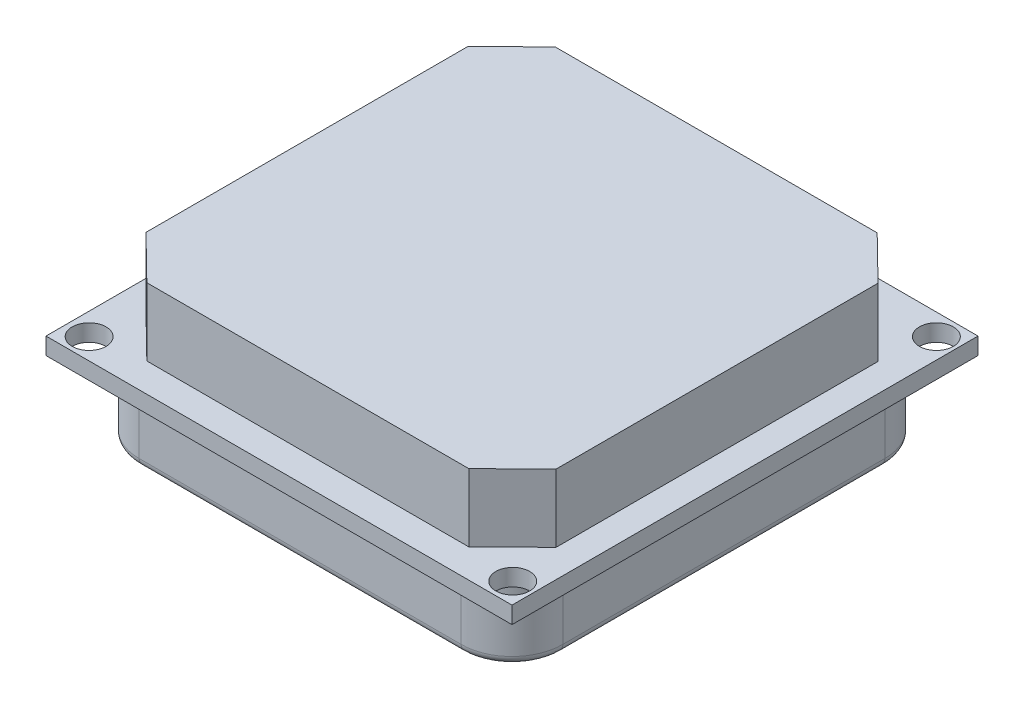
ISO-10303-21;
HEADER;
FILE_DESCRIPTION(('STEP AP214'),'2;1');
FILE_NAME('part.step','',(''),(''),'','','');
FILE_SCHEMA(('AUTOMOTIVE_DESIGN { 1 0 10303 214 1 1 1 1 }'));
ENDSEC;
DATA;
#1=APPLICATION_CONTEXT('core data for automotive mechanical design processes');
#2=APPLICATION_PROTOCOL_DEFINITION('international standard','automotive_design',2000,#1);
#3=PRODUCT_CONTEXT('',#1,'mechanical');
#4=PRODUCT('Part','Part','',(#3));
#5=PRODUCT_RELATED_PRODUCT_CATEGORY('part','',(#4));
#6=PRODUCT_DEFINITION_FORMATION('','',#4);
#7=PRODUCT_DEFINITION_CONTEXT('part definition',#1,'design');
#8=PRODUCT_DEFINITION('design','',#6,#7);
#9=PRODUCT_DEFINITION_SHAPE('','',#8);
#10=(LENGTH_UNIT() NAMED_UNIT(*) SI_UNIT(.MILLI.,.METRE.));
#11=(NAMED_UNIT(*) PLANE_ANGLE_UNIT() SI_UNIT($,.RADIAN.));
#12=(NAMED_UNIT(*) SI_UNIT($,.STERADIAN.) SOLID_ANGLE_UNIT());
#13=UNCERTAINTY_MEASURE_WITH_UNIT(LENGTH_MEASURE(1.E-05),#10,'distance_accuracy_value','');
#14=(GEOMETRIC_REPRESENTATION_CONTEXT(3) GLOBAL_UNCERTAINTY_ASSIGNED_CONTEXT((#13)) GLOBAL_UNIT_ASSIGNED_CONTEXT((#10,
#11,#12)) REPRESENTATION_CONTEXT('',''));
#15=CARTESIAN_POINT('',(0.,0.,0.));
#16=DIRECTION('',(0.,0.,1.));
#17=DIRECTION('',(1.,0.,0.));
#18=AXIS2_PLACEMENT_3D('',#15,#16,#17);
#19=CARTESIAN_POINT('',(0.,0.,0.));
#20=DIRECTION('',(0.,1.,0.));
#21=DIRECTION('',(0.,0.,1.));
#22=AXIS2_PLACEMENT_3D('',#19,#20,#21);
#23=PLANE('',#22);
#24=DIRECTION('',(-1.,0.,0.));
#25=VECTOR('',#24,1.);
#26=CARTESIAN_POINT('',(13.75,0.,-13.75));
#27=LINE('',#26,#25);
#28=CARTESIAN_POINT('',(13.75,0.,-13.75));
#29=VERTEX_POINT('',#28);
#30=CARTESIAN_POINT('',(-13.75,0.,-13.75));
#31=VERTEX_POINT('',#30);
#32=EDGE_CURVE('E324',#29,#31,#27,.T.);
#33=ORIENTED_EDGE('',*,*,#32,.F.);
#34=DIRECTION('',(0.,0.,-1.));
#35=VECTOR('',#34,1.);
#36=CARTESIAN_POINT('',(13.75,0.,-13.75));
#37=LINE('',#36,#35);
#38=CARTESIAN_POINT('',(13.75,0.,13.75));
#39=VERTEX_POINT('',#38);
#40=EDGE_CURVE('E331',#39,#29,#37,.T.);
#41=ORIENTED_EDGE('',*,*,#40,.F.);
#42=DIRECTION('',(1.,0.,0.));
#43=VECTOR('',#42,1.);
#44=CARTESIAN_POINT('',(13.75,0.,13.75));
#45=LINE('',#44,#43);
#46=CARTESIAN_POINT('',(-13.75,0.,13.75));
#47=VERTEX_POINT('',#46);
#48=EDGE_CURVE('E342',#47,#39,#45,.T.);
#49=ORIENTED_EDGE('',*,*,#48,.F.);
#50=DIRECTION('',(0.,0.,1.));
#51=VECTOR('',#50,1.);
#52=CARTESIAN_POINT('',(-13.75,0.,-13.75));
#53=LINE('',#52,#51);
#54=EDGE_CURVE('E340',#31,#47,#53,.T.);
#55=ORIENTED_EDGE('',*,*,#54,.F.);
#56=EDGE_LOOP('',(#33,#41,#49,#55));
#57=FACE_BOUND('',#56,.T.);
#58=CARTESIAN_POINT('',(-12.4479717343854,0.,-12.4920969026307));
#59=DIRECTION('',(0.,1.,0.));
#60=DIRECTION('',(0.,0.,1.));
#61=AXIS2_PLACEMENT_3D('',#58,#59,#60);
#62=CIRCLE('',#61,1.);
#63=CARTESIAN_POINT('',(-12.4479717343854,0.,-11.4920969026307));
#64=VERTEX_POINT('',#63);
#65=EDGE_CURVE('E321',#64,#64,#62,.T.);
#66=ORIENTED_EDGE('',*,*,#65,.T.);
#67=EDGE_LOOP('',(#66));
#68=FACE_BOUND('',#67,.T.);
#69=CARTESIAN_POINT('',(12.5520282656146,0.,-12.4920969026307));
#70=DIRECTION('',(0.,1.,0.));
#71=DIRECTION('',(0.,0.,1.));
#72=AXIS2_PLACEMENT_3D('',#69,#70,#71);
#73=CIRCLE('',#72,1.);
#74=CARTESIAN_POINT('',(12.5520282656146,0.,-11.4920969026307));
#75=VERTEX_POINT('',#74);
#76=EDGE_CURVE('E303',#75,#75,#73,.T.);
#77=ORIENTED_EDGE('',*,*,#76,.T.);
#78=EDGE_LOOP('',(#77));
#79=FACE_BOUND('',#78,.T.);
#80=CARTESIAN_POINT('',(12.5520282656146,0.,12.5079030973693));
#81=DIRECTION('',(0.,1.,0.));
#82=DIRECTION('',(0.,0.,1.));
#83=AXIS2_PLACEMENT_3D('',#80,#81,#82);
#84=CIRCLE('',#83,1.);
#85=CARTESIAN_POINT('',(12.5520282656146,0.,13.5079030973693));
#86=VERTEX_POINT('',#85);
#87=EDGE_CURVE('E310',#86,#86,#84,.T.);
#88=ORIENTED_EDGE('',*,*,#87,.T.);
#89=EDGE_LOOP('',(#88));
#90=FACE_BOUND('',#89,.T.);
#91=CARTESIAN_POINT('',(-12.4479717343854,0.,12.5079030973693));
#92=DIRECTION('',(0.,1.,0.));
#93=DIRECTION('',(0.,0.,1.));
#94=AXIS2_PLACEMENT_3D('',#91,#92,#93);
#95=CIRCLE('',#94,1.);
#96=CARTESIAN_POINT('',(-12.4479717343854,0.,13.5079030973693));
#97=VERTEX_POINT('',#96);
#98=EDGE_CURVE('E316',#97,#97,#95,.T.);
#99=ORIENTED_EDGE('',*,*,#98,.T.);
#100=EDGE_LOOP('',(#99));
#101=FACE_BOUND('',#100,.T.);
#102=CARTESIAN_POINT('',(-9.5,0.,9.5));
#103=DIRECTION('',(0.,-1.,0.));
#104=DIRECTION('',(0.,0.,1.));
#105=AXIS2_PLACEMENT_3D('',#102,#103,#104);
#106=CIRCLE('',#105,3.);
#107=CARTESIAN_POINT('',(-9.5,0.,12.5));
#108=VERTEX_POINT('',#107);
#109=CARTESIAN_POINT('',(-12.5,0.,9.5));
#110=VERTEX_POINT('',#109);
#111=EDGE_CURVE('E206',#108,#110,#106,.T.);
#112=ORIENTED_EDGE('',*,*,#111,.F.);
#113=DIRECTION('',(-1.,0.,0.));
#114=VECTOR('',#113,1.);
#115=CARTESIAN_POINT('',(-9.5,0.,12.5));
#116=LINE('',#115,#114);
#117=CARTESIAN_POINT('',(9.5,0.,12.5));
#118=VERTEX_POINT('',#117);
#119=EDGE_CURVE('E212',#118,#108,#116,.T.);
#120=ORIENTED_EDGE('',*,*,#119,.F.);
#121=CARTESIAN_POINT('',(9.5,0.,9.5));
#122=DIRECTION('',(0.,-1.,0.));
#123=DIRECTION('',(0.,0.,1.));
#124=AXIS2_PLACEMENT_3D('',#121,#122,#123);
#125=CIRCLE('',#124,3.00000000000001);
#126=CARTESIAN_POINT('',(12.5,0.,9.5));
#127=VERTEX_POINT('',#126);
#128=EDGE_CURVE('E226',#127,#118,#125,.T.);
#129=ORIENTED_EDGE('',*,*,#128,.F.);
#130=DIRECTION('',(0.,0.,1.));
#131=VECTOR('',#130,1.);
#132=CARTESIAN_POINT('',(12.5,0.,9.5));
#133=LINE('',#132,#131);
#134=CARTESIAN_POINT('',(12.5,0.,-9.5));
#135=VERTEX_POINT('',#134);
#136=EDGE_CURVE('E228',#135,#127,#133,.T.);
#137=ORIENTED_EDGE('',*,*,#136,.F.);
#138=CARTESIAN_POINT('',(9.49999999999999,0.,-9.5));
#139=DIRECTION('',(0.,-1.,0.));
#140=DIRECTION('',(0.,0.,1.));
#141=AXIS2_PLACEMENT_3D('',#138,#139,#140);
#142=CIRCLE('',#141,3.00000000000001);
#143=CARTESIAN_POINT('',(9.5,0.,-12.5));
#144=VERTEX_POINT('',#143);
#145=EDGE_CURVE('E425',#144,#135,#142,.T.);
#146=ORIENTED_EDGE('',*,*,#145,.F.);
#147=DIRECTION('',(1.,0.,0.));
#148=VECTOR('',#147,1.);
#149=CARTESIAN_POINT('',(9.5,0.,-12.5));
#150=LINE('',#149,#148);
#151=CARTESIAN_POINT('',(-9.5,0.,-12.5));
#152=VERTEX_POINT('',#151);
#153=EDGE_CURVE('E422',#152,#144,#150,.T.);
#154=ORIENTED_EDGE('',*,*,#153,.F.);
#155=CARTESIAN_POINT('',(-9.5,0.,-9.50000000000001));
#156=DIRECTION('',(0.,-1.,0.));
#157=DIRECTION('',(0.,0.,1.));
#158=AXIS2_PLACEMENT_3D('',#155,#156,#157);
#159=CIRCLE('',#158,2.99999999999999);
#160=CARTESIAN_POINT('',(-12.5,0.,-9.5));
#161=VERTEX_POINT('',#160);
#162=EDGE_CURVE('E419',#161,#152,#159,.T.);
#163=ORIENTED_EDGE('',*,*,#162,.F.);
#164=DIRECTION('',(0.,0.,-1.));
#165=VECTOR('',#164,1.);
#166=CARTESIAN_POINT('',(-12.5,0.,-9.5));
#167=LINE('',#166,#165);
#168=EDGE_CURVE('E221',#110,#161,#167,.T.);
#169=ORIENTED_EDGE('',*,*,#168,.F.);
#170=EDGE_LOOP('',(#112,#120,#129,#137,#146,#154,#163,#169));
#171=FACE_BOUND('',#170,.T.);
#172=ADVANCED_FACE('F40',(#57,#68,#79,#90,#101,#171),#23,.F.);
#173=CARTESIAN_POINT('',(0.,1.,0.));
#174=DIRECTION('',(0.,1.,0.));
#175=DIRECTION('',(0.,0.,1.));
#176=AXIS2_PLACEMENT_3D('',#173,#174,#175);
#177=PLANE('',#176);
#178=CARTESIAN_POINT('',(-12.4479717343854,1.,12.5079030973693));
#179=DIRECTION('',(0.,1.,0.));
#180=DIRECTION('',(0.,0.,1.));
#181=AXIS2_PLACEMENT_3D('',#178,#179,#180);
#182=CIRCLE('',#181,1.);
#183=CARTESIAN_POINT('',(-12.4479717343854,1.,13.5079030973693));
#184=VERTEX_POINT('',#183);
#185=EDGE_CURVE('E302',#184,#184,#182,.T.);
#186=ORIENTED_EDGE('',*,*,#185,.F.);
#187=EDGE_LOOP('',(#186));
#188=FACE_BOUND('',#187,.T.);
#189=CARTESIAN_POINT('',(12.5520282656146,1.,12.5079030973693));
#190=DIRECTION('',(0.,1.,0.));
#191=DIRECTION('',(0.,0.,1.));
#192=AXIS2_PLACEMENT_3D('',#189,#190,#191);
#193=CIRCLE('',#192,1.);
#194=CARTESIAN_POINT('',(12.5520282656146,1.,13.5079030973693));
#195=VERTEX_POINT('',#194);
#196=EDGE_CURVE('E313',#195,#195,#193,.T.);
#197=ORIENTED_EDGE('',*,*,#196,.F.);
#198=EDGE_LOOP('',(#197));
#199=FACE_BOUND('',#198,.T.);
#200=CARTESIAN_POINT('',(12.5520282656146,1.,-12.4920969026307));
#201=DIRECTION('',(0.,1.,0.));
#202=DIRECTION('',(0.,0.,1.));
#203=AXIS2_PLACEMENT_3D('',#200,#201,#202);
#204=CIRCLE('',#203,1.);
#205=CARTESIAN_POINT('',(12.5520282656146,1.,-11.4920969026307));
#206=VERTEX_POINT('',#205);
#207=EDGE_CURVE('E307',#206,#206,#204,.T.);
#208=ORIENTED_EDGE('',*,*,#207,.F.);
#209=EDGE_LOOP('',(#208));
#210=FACE_BOUND('',#209,.T.);
#211=CARTESIAN_POINT('',(-12.4479717343854,1.,-12.4920969026307));
#212=DIRECTION('',(0.,1.,0.));
#213=DIRECTION('',(0.,0.,1.));
#214=AXIS2_PLACEMENT_3D('',#211,#212,#213);
#215=CIRCLE('',#214,1.);
#216=CARTESIAN_POINT('',(-12.4479717343854,1.,-11.4920969026307));
#217=VERTEX_POINT('',#216);
#218=EDGE_CURVE('E306',#217,#217,#215,.T.);
#219=ORIENTED_EDGE('',*,*,#218,.F.);
#220=EDGE_LOOP('',(#219));
#221=FACE_BOUND('',#220,.T.);
#222=DIRECTION('',(-1.,0.,0.));
#223=VECTOR('',#222,1.);
#224=CARTESIAN_POINT('',(13.75,1.,-13.75));
#225=LINE('',#224,#223);
#226=CARTESIAN_POINT('',(13.75,1.,-13.75));
#227=VERTEX_POINT('',#226);
#228=CARTESIAN_POINT('',(-13.75,1.,-13.75));
#229=VERTEX_POINT('',#228);
#230=EDGE_CURVE('E327',#227,#229,#225,.T.);
#231=ORIENTED_EDGE('',*,*,#230,.T.);
#232=DIRECTION('',(0.,0.,1.));
#233=VECTOR('',#232,1.);
#234=CARTESIAN_POINT('',(-13.75,1.,-13.75));
#235=LINE('',#234,#233);
#236=CARTESIAN_POINT('',(-13.75,1.,13.75));
#237=VERTEX_POINT('',#236);
#238=EDGE_CURVE('E330',#229,#237,#235,.T.);
#239=ORIENTED_EDGE('',*,*,#238,.T.);
#240=DIRECTION('',(1.,0.,0.));
#241=VECTOR('',#240,1.);
#242=CARTESIAN_POINT('',(13.75,1.,13.75));
#243=LINE('',#242,#241);
#244=CARTESIAN_POINT('',(13.75,1.,13.75));
#245=VERTEX_POINT('',#244);
#246=EDGE_CURVE('E333',#237,#245,#243,.T.);
#247=ORIENTED_EDGE('',*,*,#246,.T.);
#248=DIRECTION('',(0.,0.,-1.));
#249=VECTOR('',#248,1.);
#250=CARTESIAN_POINT('',(13.75,1.,-13.75));
#251=LINE('',#250,#249);
#252=EDGE_CURVE('E335',#245,#227,#251,.T.);
#253=ORIENTED_EDGE('',*,*,#252,.T.);
#254=EDGE_LOOP('',(#231,#239,#247,#253));
#255=FACE_BOUND('',#254,.T.);
#256=DIRECTION('',(0.713938248596245,0.,0.700208666892468));
#257=VECTOR('',#256,1.);
#258=CARTESIAN_POINT('',(-12.1,1.,9.5));
#259=LINE('',#258,#257);
#260=CARTESIAN_POINT('',(-12.1,1.,9.5));
#261=VERTEX_POINT('',#260);
#262=CARTESIAN_POINT('',(-9.49999999999999,1.,12.05));
#263=VERTEX_POINT('',#262);
#264=EDGE_CURVE('E267',#261,#263,#259,.T.);
#265=ORIENTED_EDGE('',*,*,#264,.F.);
#266=DIRECTION('',(0.,0.,1.));
#267=VECTOR('',#266,1.);
#268=CARTESIAN_POINT('',(-12.1,1.,-9.5));
#269=LINE('',#268,#267);
#270=CARTESIAN_POINT('',(-12.1,1.,-9.5));
#271=VERTEX_POINT('',#270);
#272=EDGE_CURVE('E245',#271,#261,#269,.T.);
#273=ORIENTED_EDGE('',*,*,#272,.F.);
#274=DIRECTION('',(-0.713938248596244,0.,0.700208666892468));
#275=VECTOR('',#274,1.);
#276=CARTESIAN_POINT('',(-9.49999999999999,1.,-12.05));
#277=LINE('',#276,#275);
#278=CARTESIAN_POINT('',(-9.49999999999999,1.,-12.05));
#279=VERTEX_POINT('',#278);
#280=EDGE_CURVE('E250',#279,#271,#277,.T.);
#281=ORIENTED_EDGE('',*,*,#280,.F.);
#282=DIRECTION('',(-1.,0.,0.));
#283=VECTOR('',#282,1.);
#284=CARTESIAN_POINT('',(9.5,1.,-12.05));
#285=LINE('',#284,#283);
#286=CARTESIAN_POINT('',(9.5,1.,-12.05));
#287=VERTEX_POINT('',#286);
#288=EDGE_CURVE('E277',#287,#279,#285,.T.);
#289=ORIENTED_EDGE('',*,*,#288,.F.);
#290=DIRECTION('',(-0.713938248596244,0.,-0.700208666892468));
#291=VECTOR('',#290,1.);
#292=CARTESIAN_POINT('',(12.1,1.,-9.50000000000001));
#293=LINE('',#292,#291);
#294=CARTESIAN_POINT('',(12.1,1.,-9.50000000000001));
#295=VERTEX_POINT('',#294);
#296=EDGE_CURVE('E275',#295,#287,#293,.T.);
#297=ORIENTED_EDGE('',*,*,#296,.F.);
#298=DIRECTION('',(0.,0.,-1.));
#299=VECTOR('',#298,1.);
#300=CARTESIAN_POINT('',(12.1,1.,9.49999999999999));
#301=LINE('',#300,#299);
#302=CARTESIAN_POINT('',(12.1,1.,9.49999999999999));
#303=VERTEX_POINT('',#302);
#304=EDGE_CURVE('E273',#303,#295,#301,.T.);
#305=ORIENTED_EDGE('',*,*,#304,.F.);
#306=DIRECTION('',(0.713938248596243,0.,-0.700208666892469));
#307=VECTOR('',#306,1.);
#308=CARTESIAN_POINT('',(9.5,1.,12.05));
#309=LINE('',#308,#307);
#310=CARTESIAN_POINT('',(9.5,1.,12.05));
#311=VERTEX_POINT('',#310);
#312=EDGE_CURVE('E271',#311,#303,#309,.T.);
#313=ORIENTED_EDGE('',*,*,#312,.F.);
#314=DIRECTION('',(1.,0.,0.));
#315=VECTOR('',#314,1.);
#316=CARTESIAN_POINT('',(-9.49999999999999,1.,12.05));
#317=LINE('',#316,#315);
#318=EDGE_CURVE('E269',#263,#311,#317,.T.);
#319=ORIENTED_EDGE('',*,*,#318,.F.);
#320=EDGE_LOOP('',(#265,#273,#281,#289,#297,#305,#313,#319));
#321=FACE_BOUND('',#320,.T.);
#322=ADVANCED_FACE('F488',(#188,#199,#210,#221,#255,#321),#177,.T.);
#323=CARTESIAN_POINT('',(13.75,1.,-13.75));
#324=DIRECTION('',(0.,0.,1.));
#325=DIRECTION('',(1.,0.,0.));
#326=AXIS2_PLACEMENT_3D('',#323,#324,#325);
#327=PLANE('',#326);
#328=ORIENTED_EDGE('',*,*,#32,.T.);
#329=DIRECTION('',(0.,-1.,0.));
#330=VECTOR('',#329,1.);
#331=CARTESIAN_POINT('',(-13.75,1.,-13.75));
#332=LINE('',#331,#330);
#333=EDGE_CURVE('E353',#229,#31,#332,.T.);
#334=ORIENTED_EDGE('',*,*,#333,.F.);
#335=ORIENTED_EDGE('',*,*,#230,.F.);
#336=DIRECTION('',(0.,-1.,0.));
#337=VECTOR('',#336,1.);
#338=CARTESIAN_POINT('',(13.75,1.,-13.75));
#339=LINE('',#338,#337);
#340=EDGE_CURVE('E337',#227,#29,#339,.T.);
#341=ORIENTED_EDGE('',*,*,#340,.T.);
#342=EDGE_LOOP('',(#328,#334,#335,#341));
#343=FACE_BOUND('',#342,.T.);
#344=ADVANCED_FACE('F494',(#343),#327,.F.);
#345=CARTESIAN_POINT('',(-13.75,1.,-13.75));
#346=DIRECTION('',(1.,0.,0.));
#347=DIRECTION('',(0.,0.,-1.));
#348=AXIS2_PLACEMENT_3D('',#345,#346,#347);
#349=PLANE('',#348);
#350=ORIENTED_EDGE('',*,*,#54,.T.);
#351=DIRECTION('',(0.,-1.,0.));
#352=VECTOR('',#351,1.);
#353=CARTESIAN_POINT('',(-13.75,1.,13.75));
#354=LINE('',#353,#352);
#355=EDGE_CURVE('E350',#237,#47,#354,.T.);
#356=ORIENTED_EDGE('',*,*,#355,.F.);
#357=ORIENTED_EDGE('',*,*,#238,.F.);
#358=ORIENTED_EDGE('',*,*,#333,.T.);
#359=EDGE_LOOP('',(#350,#356,#357,#358));
#360=FACE_BOUND('',#359,.T.);
#361=ADVANCED_FACE('F509',(#360),#349,.F.);
#362=CARTESIAN_POINT('',(13.75,1.,13.75));
#363=DIRECTION('',(0.,0.,-1.));
#364=DIRECTION('',(-1.,0.,0.));
#365=AXIS2_PLACEMENT_3D('',#362,#363,#364);
#366=PLANE('',#365);
#367=ORIENTED_EDGE('',*,*,#48,.T.);
#368=DIRECTION('',(0.,-1.,0.));
#369=VECTOR('',#368,1.);
#370=CARTESIAN_POINT('',(13.75,1.,13.75));
#371=LINE('',#370,#369);
#372=EDGE_CURVE('E347',#245,#39,#371,.T.);
#373=ORIENTED_EDGE('',*,*,#372,.F.);
#374=ORIENTED_EDGE('',*,*,#246,.F.);
#375=ORIENTED_EDGE('',*,*,#355,.T.);
#376=EDGE_LOOP('',(#367,#373,#374,#375));
#377=FACE_BOUND('',#376,.T.);
#378=ADVANCED_FACE('F505',(#377),#366,.F.);
#379=CARTESIAN_POINT('',(13.75,1.,-13.75));
#380=DIRECTION('',(-1.,0.,0.));
#381=DIRECTION('',(0.,0.,1.));
#382=AXIS2_PLACEMENT_3D('',#379,#380,#381);
#383=PLANE('',#382);
#384=ORIENTED_EDGE('',*,*,#40,.T.);
#385=ORIENTED_EDGE('',*,*,#340,.F.);
#386=ORIENTED_EDGE('',*,*,#252,.F.);
#387=ORIENTED_EDGE('',*,*,#372,.T.);
#388=EDGE_LOOP('',(#384,#385,#386,#387));
#389=FACE_BOUND('',#388,.T.);
#390=ADVANCED_FACE('F501',(#389),#383,.F.);
#391=CARTESIAN_POINT('',(-12.4479717343854,0.,-12.4920969026307));
#392=DIRECTION('',(0.,1.,0.));
#393=DIRECTION('',(0.,0.,1.));
#394=AXIS2_PLACEMENT_3D('',#391,#392,#393);
#395=CYLINDRICAL_SURFACE('',#394,1.);
#396=ORIENTED_EDGE('',*,*,#65,.F.);
#397=EDGE_LOOP('',(#396));
#398=FACE_BOUND('',#397,.T.);
#399=ORIENTED_EDGE('',*,*,#218,.T.);
#400=EDGE_LOOP('',(#399));
#401=FACE_BOUND('',#400,.T.);
#402=ADVANCED_FACE('F504',(#398,#401),#395,.F.);
#403=CARTESIAN_POINT('',(12.5520282656146,0.,-12.4920969026307));
#404=DIRECTION('',(0.,1.,0.));
#405=DIRECTION('',(0.,0.,1.));
#406=AXIS2_PLACEMENT_3D('',#403,#404,#405);
#407=CYLINDRICAL_SURFACE('',#406,1.);
#408=ORIENTED_EDGE('',*,*,#76,.F.);
#409=EDGE_LOOP('',(#408));
#410=FACE_BOUND('',#409,.T.);
#411=ORIENTED_EDGE('',*,*,#207,.T.);
#412=EDGE_LOOP('',(#411));
#413=FACE_BOUND('',#412,.T.);
#414=ADVANCED_FACE('F729',(#410,#413),#407,.F.);
#415=CARTESIAN_POINT('',(12.5520282656146,0.,12.5079030973693));
#416=DIRECTION('',(0.,1.,0.));
#417=DIRECTION('',(0.,0.,1.));
#418=AXIS2_PLACEMENT_3D('',#415,#416,#417);
#419=CYLINDRICAL_SURFACE('',#418,1.);
#420=ORIENTED_EDGE('',*,*,#87,.F.);
#421=EDGE_LOOP('',(#420));
#422=FACE_BOUND('',#421,.T.);
#423=ORIENTED_EDGE('',*,*,#196,.T.);
#424=EDGE_LOOP('',(#423));
#425=FACE_BOUND('',#424,.T.);
#426=ADVANCED_FACE('F721',(#422,#425),#419,.F.);
#427=CARTESIAN_POINT('',(-12.4479717343854,0.,12.5079030973693));
#428=DIRECTION('',(0.,1.,0.));
#429=DIRECTION('',(0.,0.,1.));
#430=AXIS2_PLACEMENT_3D('',#427,#428,#429);
#431=CYLINDRICAL_SURFACE('',#430,1.);
#432=ORIENTED_EDGE('',*,*,#98,.F.);
#433=EDGE_LOOP('',(#432));
#434=FACE_BOUND('',#433,.T.);
#435=ORIENTED_EDGE('',*,*,#185,.T.);
#436=EDGE_LOOP('',(#435));
#437=FACE_BOUND('',#436,.T.);
#438=ADVANCED_FACE('F712',(#434,#437),#431,.F.);
#439=CARTESIAN_POINT('',(-12.1,5.,-9.5));
#440=DIRECTION('',(1.,0.,0.));
#441=DIRECTION('',(0.,0.,-1.));
#442=AXIS2_PLACEMENT_3D('',#439,#440,#441);
#443=PLANE('',#442);
#444=ORIENTED_EDGE('',*,*,#272,.T.);
#445=DIRECTION('',(0.,-1.,0.));
#446=VECTOR('',#445,1.);
#447=CARTESIAN_POINT('',(-12.1,5.,9.5));
#448=LINE('',#447,#446);
#449=CARTESIAN_POINT('',(-12.1,5.,9.5));
#450=VERTEX_POINT('',#449);
#451=EDGE_CURVE('E300',#450,#261,#448,.T.);
#452=ORIENTED_EDGE('',*,*,#451,.F.);
#453=DIRECTION('',(0.,0.,1.));
#454=VECTOR('',#453,1.);
#455=CARTESIAN_POINT('',(-12.1,5.,-9.5));
#456=LINE('',#455,#454);
#457=CARTESIAN_POINT('',(-12.1,5.,-9.5));
#458=VERTEX_POINT('',#457);
#459=EDGE_CURVE('E246',#458,#450,#456,.T.);
#460=ORIENTED_EDGE('',*,*,#459,.F.);
#461=DIRECTION('',(0.,-1.,0.));
#462=VECTOR('',#461,1.);
#463=CARTESIAN_POINT('',(-12.1,5.,-9.5));
#464=LINE('',#463,#462);
#465=EDGE_CURVE('E264',#458,#271,#464,.T.);
#466=ORIENTED_EDGE('',*,*,#465,.T.);
#467=EDGE_LOOP('',(#444,#452,#460,#466));
#468=FACE_BOUND('',#467,.T.);
#469=ADVANCED_FACE('F704',(#468),#443,.F.);
#470=CARTESIAN_POINT('',(-12.1,5.,9.5));
#471=DIRECTION('',(0.700208666892468,0.,-0.713938248596245));
#472=DIRECTION('',(-0.713938248596245,0.,-0.700208666892468));
#473=AXIS2_PLACEMENT_3D('',#470,#471,#472);
#474=PLANE('',#473);
#475=ORIENTED_EDGE('',*,*,#264,.T.);
#476=DIRECTION('',(0.,-1.,0.));
#477=VECTOR('',#476,1.);
#478=CARTESIAN_POINT('',(-9.49999999999999,5.,12.05));
#479=LINE('',#478,#477);
#480=CARTESIAN_POINT('',(-9.49999999999999,5.,12.05));
#481=VERTEX_POINT('',#480);
#482=EDGE_CURVE('E297',#481,#263,#479,.T.);
#483=ORIENTED_EDGE('',*,*,#482,.F.);
#484=DIRECTION('',(0.713938248596245,0.,0.700208666892468));
#485=VECTOR('',#484,1.);
#486=CARTESIAN_POINT('',(-12.1,5.,9.5));
#487=LINE('',#486,#485);
#488=EDGE_CURVE('E249',#450,#481,#487,.T.);
#489=ORIENTED_EDGE('',*,*,#488,.F.);
#490=ORIENTED_EDGE('',*,*,#451,.T.);
#491=EDGE_LOOP('',(#475,#483,#489,#490));
#492=FACE_BOUND('',#491,.T.);
#493=ADVANCED_FACE('F696',(#492),#474,.F.);
#494=CARTESIAN_POINT('',(-9.49999999999999,5.,12.05));
#495=DIRECTION('',(0.,0.,-1.));
#496=DIRECTION('',(-1.,0.,0.));
#497=AXIS2_PLACEMENT_3D('',#494,#495,#496);
#498=PLANE('',#497);
#499=ORIENTED_EDGE('',*,*,#318,.T.);
#500=DIRECTION('',(0.,-1.,0.));
#501=VECTOR('',#500,1.);
#502=CARTESIAN_POINT('',(9.5,5.,12.05));
#503=LINE('',#502,#501);
#504=CARTESIAN_POINT('',(9.5,5.,12.05));
#505=VERTEX_POINT('',#504);
#506=EDGE_CURVE('E294',#505,#311,#503,.T.);
#507=ORIENTED_EDGE('',*,*,#506,.F.);
#508=DIRECTION('',(1.,0.,0.));
#509=VECTOR('',#508,1.);
#510=CARTESIAN_POINT('',(-9.49999999999999,5.,12.05));
#511=LINE('',#510,#509);
#512=EDGE_CURVE('E252',#481,#505,#511,.T.);
#513=ORIENTED_EDGE('',*,*,#512,.F.);
#514=ORIENTED_EDGE('',*,*,#482,.T.);
#515=EDGE_LOOP('',(#499,#507,#513,#514));
#516=FACE_BOUND('',#515,.T.);
#517=ADVANCED_FACE('F688',(#516),#498,.F.);
#518=CARTESIAN_POINT('',(9.5,5.,12.05));
#519=DIRECTION('',(-0.700208666892469,0.,-0.713938248596243));
#520=DIRECTION('',(-0.713938248596243,0.,0.700208666892469));
#521=AXIS2_PLACEMENT_3D('',#518,#519,#520);
#522=PLANE('',#521);
#523=ORIENTED_EDGE('',*,*,#312,.T.);
#524=DIRECTION('',(0.,-1.,0.));
#525=VECTOR('',#524,1.);
#526=CARTESIAN_POINT('',(12.1,5.,9.49999999999999));
#527=LINE('',#526,#525);
#528=CARTESIAN_POINT('',(12.1,5.,9.49999999999999));
#529=VERTEX_POINT('',#528);
#530=EDGE_CURVE('E291',#529,#303,#527,.T.);
#531=ORIENTED_EDGE('',*,*,#530,.F.);
#532=DIRECTION('',(0.713938248596243,0.,-0.700208666892469));
#533=VECTOR('',#532,1.);
#534=CARTESIAN_POINT('',(9.5,5.,12.05));
#535=LINE('',#534,#533);
#536=EDGE_CURVE('E254',#505,#529,#535,.T.);
#537=ORIENTED_EDGE('',*,*,#536,.F.);
#538=ORIENTED_EDGE('',*,*,#506,.T.);
#539=EDGE_LOOP('',(#523,#531,#537,#538));
#540=FACE_BOUND('',#539,.T.);
#541=ADVANCED_FACE('F680',(#540),#522,.F.);
#542=CARTESIAN_POINT('',(12.1,5.,9.49999999999999));
#543=DIRECTION('',(-1.,0.,0.));
#544=DIRECTION('',(0.,0.,1.));
#545=AXIS2_PLACEMENT_3D('',#542,#543,#544);
#546=PLANE('',#545);
#547=ORIENTED_EDGE('',*,*,#304,.T.);
#548=DIRECTION('',(0.,-1.,0.));
#549=VECTOR('',#548,1.);
#550=CARTESIAN_POINT('',(12.1,5.,-9.50000000000001));
#551=LINE('',#550,#549);
#552=CARTESIAN_POINT('',(12.1,5.,-9.50000000000001));
#553=VERTEX_POINT('',#552);
#554=EDGE_CURVE('E288',#553,#295,#551,.T.);
#555=ORIENTED_EDGE('',*,*,#554,.F.);
#556=DIRECTION('',(0.,0.,-1.));
#557=VECTOR('',#556,1.);
#558=CARTESIAN_POINT('',(12.1,5.,9.49999999999999));
#559=LINE('',#558,#557);
#560=EDGE_CURVE('E256',#529,#553,#559,.T.);
#561=ORIENTED_EDGE('',*,*,#560,.F.);
#562=ORIENTED_EDGE('',*,*,#530,.T.);
#563=EDGE_LOOP('',(#547,#555,#561,#562));
#564=FACE_BOUND('',#563,.T.);
#565=ADVANCED_FACE('F672',(#564),#546,.F.);
#566=CARTESIAN_POINT('',(12.1,5.,-9.50000000000001));
#567=DIRECTION('',(-0.700208666892468,0.,0.713938248596244));
#568=DIRECTION('',(0.713938248596244,0.,0.700208666892468));
#569=AXIS2_PLACEMENT_3D('',#566,#567,#568);
#570=PLANE('',#569);
#571=ORIENTED_EDGE('',*,*,#296,.T.);
#572=DIRECTION('',(0.,-1.,0.));
#573=VECTOR('',#572,1.);
#574=CARTESIAN_POINT('',(9.5,5.,-12.05));
#575=LINE('',#574,#573);
#576=CARTESIAN_POINT('',(9.5,5.,-12.05));
#577=VERTEX_POINT('',#576);
#578=EDGE_CURVE('E285',#577,#287,#575,.T.);
#579=ORIENTED_EDGE('',*,*,#578,.F.);
#580=DIRECTION('',(-0.713938248596244,0.,-0.700208666892468));
#581=VECTOR('',#580,1.);
#582=CARTESIAN_POINT('',(12.1,5.,-9.50000000000001));
#583=LINE('',#582,#581);
#584=EDGE_CURVE('E258',#553,#577,#583,.T.);
#585=ORIENTED_EDGE('',*,*,#584,.F.);
#586=ORIENTED_EDGE('',*,*,#554,.T.);
#587=EDGE_LOOP('',(#571,#579,#585,#586));
#588=FACE_BOUND('',#587,.T.);
#589=ADVANCED_FACE('F664',(#588),#570,.F.);
#590=CARTESIAN_POINT('',(9.5,5.,-12.05));
#591=DIRECTION('',(0.,0.,1.));
#592=DIRECTION('',(1.,0.,0.));
#593=AXIS2_PLACEMENT_3D('',#590,#591,#592);
#594=PLANE('',#593);
#595=ORIENTED_EDGE('',*,*,#288,.T.);
#596=DIRECTION('',(0.,-1.,0.));
#597=VECTOR('',#596,1.);
#598=CARTESIAN_POINT('',(-9.49999999999999,5.,-12.05));
#599=LINE('',#598,#597);
#600=CARTESIAN_POINT('',(-9.49999999999999,5.,-12.05));
#601=VERTEX_POINT('',#600);
#602=EDGE_CURVE('E283',#601,#279,#599,.T.);
#603=ORIENTED_EDGE('',*,*,#602,.F.);
#604=DIRECTION('',(-1.,0.,0.));
#605=VECTOR('',#604,1.);
#606=CARTESIAN_POINT('',(9.5,5.,-12.05));
#607=LINE('',#606,#605);
#608=EDGE_CURVE('E260',#577,#601,#607,.T.);
#609=ORIENTED_EDGE('',*,*,#608,.F.);
#610=ORIENTED_EDGE('',*,*,#578,.T.);
#611=EDGE_LOOP('',(#595,#603,#609,#610));
#612=FACE_BOUND('',#611,.T.);
#613=ADVANCED_FACE('F656',(#612),#594,.F.);
#614=CARTESIAN_POINT('',(-9.49999999999999,5.,-12.05));
#615=DIRECTION('',(0.700208666892468,0.,0.713938248596244));
#616=DIRECTION('',(0.713938248596244,0.,-0.700208666892468));
#617=AXIS2_PLACEMENT_3D('',#614,#615,#616);
#618=PLANE('',#617);
#619=ORIENTED_EDGE('',*,*,#280,.T.);
#620=ORIENTED_EDGE('',*,*,#465,.F.);
#621=DIRECTION('',(-0.713938248596244,0.,0.700208666892468));
#622=VECTOR('',#621,1.);
#623=CARTESIAN_POINT('',(-9.49999999999999,5.,-12.05));
#624=LINE('',#623,#622);
#625=EDGE_CURVE('E262',#601,#458,#624,.T.);
#626=ORIENTED_EDGE('',*,*,#625,.F.);
#627=ORIENTED_EDGE('',*,*,#602,.T.);
#628=EDGE_LOOP('',(#619,#620,#626,#627));
#629=FACE_BOUND('',#628,.T.);
#630=ADVANCED_FACE('F648',(#629),#618,.F.);
#631=CARTESIAN_POINT('',(0.,5.,0.));
#632=DIRECTION('',(0.,1.,0.));
#633=DIRECTION('',(0.,0.,1.));
#634=AXIS2_PLACEMENT_3D('',#631,#632,#633);
#635=PLANE('',#634);
#636=ORIENTED_EDGE('',*,*,#459,.T.);
#637=ORIENTED_EDGE('',*,*,#488,.T.);
#638=ORIENTED_EDGE('',*,*,#512,.T.);
#639=ORIENTED_EDGE('',*,*,#536,.T.);
#640=ORIENTED_EDGE('',*,*,#560,.T.);
#641=ORIENTED_EDGE('',*,*,#584,.T.);
#642=ORIENTED_EDGE('',*,*,#608,.T.);
#643=ORIENTED_EDGE('',*,*,#625,.T.);
#644=EDGE_LOOP('',(#636,#637,#638,#639,#640,#641,#642,#643));
#645=FACE_BOUND('',#644,.T.);
#646=ADVANCED_FACE('F641',(#645),#635,.T.);
#647=CARTESIAN_POINT('',(-9.5,-4.26,9.5));
#648=DIRECTION('',(0.,1.,0.));
#649=DIRECTION('',(0.,0.,1.));
#650=AXIS2_PLACEMENT_3D('',#647,#648,#649);
#651=CYLINDRICAL_SURFACE('',#650,3.);
#652=DIRECTION('',(0.,1.,0.));
#653=VECTOR('',#652,1.);
#654=CARTESIAN_POINT('',(-12.5,-4.26,9.5));
#655=LINE('',#654,#653);
#656=CARTESIAN_POINT('',(-12.5,-3.76,9.5));
#657=VERTEX_POINT('',#656);
#658=EDGE_CURVE('E243',#657,#110,#655,.T.);
#659=ORIENTED_EDGE('',*,*,#658,.F.);
#660=CARTESIAN_POINT('',(-9.5,-3.76,9.5));
#661=DIRECTION('',(0.,1.,0.));
#662=DIRECTION('',(0.,0.,1.));
#663=AXIS2_PLACEMENT_3D('',#660,#661,#662);
#664=CIRCLE('',#663,3.);
#665=CARTESIAN_POINT('',(-9.5,-3.76,12.5));
#666=VERTEX_POINT('',#665);
#667=EDGE_CURVE('E208',#657,#666,#664,.T.);
#668=ORIENTED_EDGE('',*,*,#667,.T.);
#669=DIRECTION('',(0.,1.,0.));
#670=VECTOR('',#669,1.);
#671=CARTESIAN_POINT('',(-9.5,-4.26,12.5));
#672=LINE('',#671,#670);
#673=EDGE_CURVE('E202',#666,#108,#672,.T.);
#674=ORIENTED_EDGE('',*,*,#673,.T.);
#675=ORIENTED_EDGE('',*,*,#111,.T.);
#676=EDGE_LOOP('',(#659,#668,#674,#675));
#677=FACE_BOUND('',#676,.T.);
#678=ADVANCED_FACE('F205',(#677),#651,.T.);
#679=CARTESIAN_POINT('',(-12.5,-4.26,-9.5));
#680=DIRECTION('',(1.,0.,0.));
#681=DIRECTION('',(0.,0.,-1.));
#682=AXIS2_PLACEMENT_3D('',#679,#680,#681);
#683=PLANE('',#682);
#684=DIRECTION('',(0.,1.,0.));
#685=VECTOR('',#684,1.);
#686=CARTESIAN_POINT('',(-12.5,-4.26,-9.5));
#687=LINE('',#686,#685);
#688=CARTESIAN_POINT('',(-12.5,-3.76,-9.5));
#689=VERTEX_POINT('',#688);
#690=EDGE_CURVE('E241',#689,#161,#687,.T.);
#691=ORIENTED_EDGE('',*,*,#690,.F.);
#692=DIRECTION('',(0.,0.,-1.));
#693=VECTOR('',#692,1.);
#694=CARTESIAN_POINT('',(-12.5,-3.76,-9.5));
#695=LINE('',#694,#693);
#696=EDGE_CURVE('E383',#689,#657,#695,.F.);
#697=ORIENTED_EDGE('',*,*,#696,.T.);
#698=ORIENTED_EDGE('',*,*,#658,.T.);
#699=ORIENTED_EDGE('',*,*,#168,.T.);
#700=EDGE_LOOP('',(#691,#697,#698,#699));
#701=FACE_BOUND('',#700,.T.);
#702=ADVANCED_FACE('F453',(#701),#683,.F.);
#703=CARTESIAN_POINT('',(-9.5,-4.26,-9.50000000000001));
#704=DIRECTION('',(0.,1.,0.));
#705=DIRECTION('',(0.,0.,1.));
#706=AXIS2_PLACEMENT_3D('',#703,#704,#705);
#707=CYLINDRICAL_SURFACE('',#706,2.99999999999999);
#708=DIRECTION('',(0.,1.,0.));
#709=VECTOR('',#708,1.);
#710=CARTESIAN_POINT('',(-9.5,-4.26,-12.5));
#711=LINE('',#710,#709);
#712=CARTESIAN_POINT('',(-9.5,-3.76,-12.5));
#713=VERTEX_POINT('',#712);
#714=EDGE_CURVE('E239',#713,#152,#711,.T.);
#715=ORIENTED_EDGE('',*,*,#714,.F.);
#716=CARTESIAN_POINT('',(-9.5,-3.76,-9.50000000000001));
#717=DIRECTION('',(0.,1.,0.));
#718=DIRECTION('',(0.,0.,1.));
#719=AXIS2_PLACEMENT_3D('',#716,#717,#718);
#720=CIRCLE('',#719,2.99999999999999);
#721=EDGE_CURVE('E49',#713,#689,#720,.T.);
#722=ORIENTED_EDGE('',*,*,#721,.T.);
#723=ORIENTED_EDGE('',*,*,#690,.T.);
#724=ORIENTED_EDGE('',*,*,#162,.T.);
#725=EDGE_LOOP('',(#715,#722,#723,#724));
#726=FACE_BOUND('',#725,.T.);
#727=ADVANCED_FACE('F623',(#726),#707,.T.);
#728=CARTESIAN_POINT('',(9.5,-4.26,-12.5));
#729=DIRECTION('',(0.,0.,1.));
#730=DIRECTION('',(1.,0.,0.));
#731=AXIS2_PLACEMENT_3D('',#728,#729,#730);
#732=PLANE('',#731);
#733=DIRECTION('',(0.,1.,0.));
#734=VECTOR('',#733,1.);
#735=CARTESIAN_POINT('',(9.5,-4.26,-12.5));
#736=LINE('',#735,#734);
#737=CARTESIAN_POINT('',(9.5,-3.76,-12.5));
#738=VERTEX_POINT('',#737);
#739=EDGE_CURVE('E237',#738,#144,#736,.T.);
#740=ORIENTED_EDGE('',*,*,#739,.F.);
#741=DIRECTION('',(1.,0.,0.));
#742=VECTOR('',#741,1.);
#743=CARTESIAN_POINT('',(9.5,-3.76,-12.5));
#744=LINE('',#743,#742);
#745=EDGE_CURVE('E11',#738,#713,#744,.F.);
#746=ORIENTED_EDGE('',*,*,#745,.T.);
#747=ORIENTED_EDGE('',*,*,#714,.T.);
#748=ORIENTED_EDGE('',*,*,#153,.T.);
#749=EDGE_LOOP('',(#740,#746,#747,#748));
#750=FACE_BOUND('',#749,.T.);
#751=ADVANCED_FACE('F438',(#750),#732,.F.);
#752=CARTESIAN_POINT('',(9.49999999999999,-4.26,-9.5));
#753=DIRECTION('',(0.,1.,0.));
#754=DIRECTION('',(0.,0.,1.));
#755=AXIS2_PLACEMENT_3D('',#752,#753,#754);
#756=CYLINDRICAL_SURFACE('',#755,3.00000000000001);
#757=DIRECTION('',(0.,1.,0.));
#758=VECTOR('',#757,1.);
#759=CARTESIAN_POINT('',(12.5,-4.26,-9.5));
#760=LINE('',#759,#758);
#761=CARTESIAN_POINT('',(12.5,-3.76,-9.5));
#762=VERTEX_POINT('',#761);
#763=EDGE_CURVE('E235',#762,#135,#760,.T.);
#764=ORIENTED_EDGE('',*,*,#763,.F.);
#765=CARTESIAN_POINT('',(9.49999999999999,-3.76,-9.5));
#766=DIRECTION('',(0.,1.,0.));
#767=DIRECTION('',(0.,0.,1.));
#768=AXIS2_PLACEMENT_3D('',#765,#766,#767);
#769=CIRCLE('',#768,3.00000000000001);
#770=EDGE_CURVE('E381',#762,#738,#769,.T.);
#771=ORIENTED_EDGE('',*,*,#770,.T.);
#772=ORIENTED_EDGE('',*,*,#739,.T.);
#773=ORIENTED_EDGE('',*,*,#145,.T.);
#774=EDGE_LOOP('',(#764,#771,#772,#773));
#775=FACE_BOUND('',#774,.T.);
#776=ADVANCED_FACE('F436',(#775),#756,.T.);
#777=CARTESIAN_POINT('',(12.5,-4.26,9.5));
#778=DIRECTION('',(-1.,0.,0.));
#779=DIRECTION('',(0.,0.,1.));
#780=AXIS2_PLACEMENT_3D('',#777,#778,#779);
#781=PLANE('',#780);
#782=DIRECTION('',(0.,1.,0.));
#783=VECTOR('',#782,1.);
#784=CARTESIAN_POINT('',(12.5,-4.26,9.5));
#785=LINE('',#784,#783);
#786=CARTESIAN_POINT('',(12.5,-3.76,9.5));
#787=VERTEX_POINT('',#786);
#788=EDGE_CURVE('E233',#787,#127,#785,.T.);
#789=ORIENTED_EDGE('',*,*,#788,.F.);
#790=DIRECTION('',(0.,0.,1.));
#791=VECTOR('',#790,1.);
#792=CARTESIAN_POINT('',(12.5,-3.76,9.5));
#793=LINE('',#792,#791);
#794=EDGE_CURVE('E379',#787,#762,#793,.F.);
#795=ORIENTED_EDGE('',*,*,#794,.T.);
#796=ORIENTED_EDGE('',*,*,#763,.T.);
#797=ORIENTED_EDGE('',*,*,#136,.T.);
#798=EDGE_LOOP('',(#789,#795,#796,#797));
#799=FACE_BOUND('',#798,.T.);
#800=ADVANCED_FACE('F431',(#799),#781,.F.);
#801=CARTESIAN_POINT('',(9.5,-4.26,9.5));
#802=DIRECTION('',(0.,1.,0.));
#803=DIRECTION('',(0.,0.,1.));
#804=AXIS2_PLACEMENT_3D('',#801,#802,#803);
#805=CYLINDRICAL_SURFACE('',#804,3.00000000000001);
#806=DIRECTION('',(0.,1.,0.));
#807=VECTOR('',#806,1.);
#808=CARTESIAN_POINT('',(9.5,-4.26,12.5));
#809=LINE('',#808,#807);
#810=CARTESIAN_POINT('',(9.5,-3.76,12.5));
#811=VERTEX_POINT('',#810);
#812=EDGE_CURVE('E211',#811,#118,#809,.T.);
#813=ORIENTED_EDGE('',*,*,#812,.F.);
#814=CARTESIAN_POINT('',(9.5,-3.76,9.5));
#815=DIRECTION('',(0.,1.,0.));
#816=DIRECTION('',(0.,0.,1.));
#817=AXIS2_PLACEMENT_3D('',#814,#815,#816);
#818=CIRCLE('',#817,3.00000000000001);
#819=EDGE_CURVE('E377',#811,#787,#818,.T.);
#820=ORIENTED_EDGE('',*,*,#819,.T.);
#821=ORIENTED_EDGE('',*,*,#788,.T.);
#822=ORIENTED_EDGE('',*,*,#128,.T.);
#823=EDGE_LOOP('',(#813,#820,#821,#822));
#824=FACE_BOUND('',#823,.T.);
#825=ADVANCED_FACE('F465',(#824),#805,.T.);
#826=CARTESIAN_POINT('',(-9.5,-4.26,12.5));
#827=DIRECTION('',(0.,0.,-1.));
#828=DIRECTION('',(-1.,0.,0.));
#829=AXIS2_PLACEMENT_3D('',#826,#827,#828);
#830=PLANE('',#829);
#831=ORIENTED_EDGE('',*,*,#673,.F.);
#832=DIRECTION('',(-1.,0.,0.));
#833=VECTOR('',#832,1.);
#834=CARTESIAN_POINT('',(-9.5,-3.76,12.5));
#835=LINE('',#834,#833);
#836=EDGE_CURVE('E375',#666,#811,#835,.F.);
#837=ORIENTED_EDGE('',*,*,#836,.T.);
#838=ORIENTED_EDGE('',*,*,#812,.T.);
#839=ORIENTED_EDGE('',*,*,#119,.T.);
#840=EDGE_LOOP('',(#831,#837,#838,#839));
#841=FACE_BOUND('',#840,.T.);
#842=ADVANCED_FACE('F224',(#841),#830,.F.);
#843=CARTESIAN_POINT('',(-9.5,-4.26,9.5));
#844=DIRECTION('',(0.,1.,0.));
#845=DIRECTION('',(0.,0.,1.));
#846=AXIS2_PLACEMENT_3D('',#843,#844,#845);
#847=PLANE('',#846);
#848=DIRECTION('',(-1.,0.,0.));
#849=VECTOR('',#848,1.);
#850=CARTESIAN_POINT('',(-9.5,-4.26,12.));
#851=LINE('',#850,#849);
#852=CARTESIAN_POINT('',(9.5,-4.26,12.));
#853=VERTEX_POINT('',#852);
#854=CARTESIAN_POINT('',(-9.5,-4.26,12.));
#855=VERTEX_POINT('',#854);
#856=EDGE_CURVE('E369',#853,#855,#851,.T.);
#857=ORIENTED_EDGE('',*,*,#856,.T.);
#858=CARTESIAN_POINT('',(-9.5,-4.26,9.5));
#859=DIRECTION('',(0.,1.,0.));
#860=DIRECTION('',(0.,0.,1.));
#861=AXIS2_PLACEMENT_3D('',#858,#859,#860);
#862=CIRCLE('',#861,2.5);
#863=CARTESIAN_POINT('',(-12.,-4.26,9.5));
#864=VERTEX_POINT('',#863);
#865=EDGE_CURVE('E371',#855,#864,#862,.F.);
#866=ORIENTED_EDGE('',*,*,#865,.T.);
#867=DIRECTION('',(0.,0.,-1.));
#868=VECTOR('',#867,1.);
#869=CARTESIAN_POINT('',(-12.,-4.26,9.5));
#870=LINE('',#869,#868);
#871=CARTESIAN_POINT('',(-12.,-4.26,-9.5));
#872=VERTEX_POINT('',#871);
#873=EDGE_CURVE('E361',#864,#872,#870,.T.);
#874=ORIENTED_EDGE('',*,*,#873,.T.);
#875=CARTESIAN_POINT('',(-9.5,-4.26,-9.50000000000001));
#876=DIRECTION('',(0.,1.,0.));
#877=DIRECTION('',(0.,0.,1.));
#878=AXIS2_PLACEMENT_3D('',#875,#876,#877);
#879=CIRCLE('',#878,2.49999999999999);
#880=CARTESIAN_POINT('',(-9.5,-4.26,-12.));
#881=VERTEX_POINT('',#880);
#882=EDGE_CURVE('E359',#872,#881,#879,.F.);
#883=ORIENTED_EDGE('',*,*,#882,.T.);
#884=DIRECTION('',(1.,0.,0.));
#885=VECTOR('',#884,1.);
#886=CARTESIAN_POINT('',(-9.5,-4.26,-12.));
#887=LINE('',#886,#885);
#888=CARTESIAN_POINT('',(9.5,-4.26,-12.));
#889=VERTEX_POINT('',#888);
#890=EDGE_CURVE('E357',#881,#889,#887,.T.);
#891=ORIENTED_EDGE('',*,*,#890,.T.);
#892=CARTESIAN_POINT('',(9.49999999999999,-4.26,-9.5));
#893=DIRECTION('',(0.,1.,0.));
#894=DIRECTION('',(0.,0.,1.));
#895=AXIS2_PLACEMENT_3D('',#892,#893,#894);
#896=CIRCLE('',#895,2.50000000000001);
#897=CARTESIAN_POINT('',(12.,-4.26,-9.5));
#898=VERTEX_POINT('',#897);
#899=EDGE_CURVE('E363',#889,#898,#896,.F.);
#900=ORIENTED_EDGE('',*,*,#899,.T.);
#901=DIRECTION('',(0.,0.,1.));
#902=VECTOR('',#901,1.);
#903=CARTESIAN_POINT('',(12.,-4.26,9.5));
#904=LINE('',#903,#902);
#905=CARTESIAN_POINT('',(12.,-4.26,9.5));
#906=VERTEX_POINT('',#905);
#907=EDGE_CURVE('E365',#898,#906,#904,.T.);
#908=ORIENTED_EDGE('',*,*,#907,.T.);
#909=CARTESIAN_POINT('',(9.5,-4.26,9.5));
#910=DIRECTION('',(0.,1.,0.));
#911=DIRECTION('',(0.,0.,1.));
#912=AXIS2_PLACEMENT_3D('',#909,#910,#911);
#913=CIRCLE('',#912,2.50000000000001);
#914=EDGE_CURVE('E367',#906,#853,#913,.F.);
#915=ORIENTED_EDGE('',*,*,#914,.T.);
#916=EDGE_LOOP('',(#857,#866,#874,#883,#891,#900,#908,#915));
#917=FACE_BOUND('',#916,.T.);
#918=CARTESIAN_POINT('',(2.5,-4.26,0.500000000000007));
#919=DIRECTION('',(0.,-1.,0.));
#920=DIRECTION('',(0.,0.,-1.));
#921=AXIS2_PLACEMENT_3D('',#918,#919,#920);
#922=CIRCLE('',#921,1.6);
#923=CARTESIAN_POINT('',(2.5,-4.26,-1.09999999999999));
#924=VERTEX_POINT('',#923);
#925=EDGE_CURVE('E356',#924,#924,#922,.T.);
#926=ORIENTED_EDGE('',*,*,#925,.F.);
#927=EDGE_LOOP('',(#926));
#928=FACE_BOUND('',#927,.T.);
#929=ADVANCED_FACE('F472',(#917,#928),#847,.F.);
#930=CARTESIAN_POINT('',(2.5,-4.56,0.500000000000007));
#931=DIRECTION('',(0.,1.,0.));
#932=DIRECTION('',(0.,0.,1.));
#933=AXIS2_PLACEMENT_3D('',#930,#931,#932);
#934=CYLINDRICAL_SURFACE('',#933,1.6);
#935=CARTESIAN_POINT('',(2.5,-4.56,0.500000000000007));
#936=DIRECTION('',(0.,-1.,0.));
#937=DIRECTION('',(0.,0.,-1.));
#938=AXIS2_PLACEMENT_3D('',#935,#936,#937);
#939=CIRCLE('',#938,1.6);
#940=CARTESIAN_POINT('',(2.5,-4.56,-1.09999999999999));
#941=VERTEX_POINT('',#940);
#942=EDGE_CURVE('E222',#941,#941,#939,.T.);
#943=ORIENTED_EDGE('',*,*,#942,.F.);
#944=EDGE_LOOP('',(#943));
#945=FACE_BOUND('',#944,.T.);
#946=ORIENTED_EDGE('',*,*,#925,.T.);
#947=EDGE_LOOP('',(#946));
#948=FACE_BOUND('',#947,.T.);
#949=ADVANCED_FACE('F475',(#945,#948),#934,.T.);
#950=CARTESIAN_POINT('',(2.5,-4.56,0.500000000000007));
#951=DIRECTION('',(0.,-1.,0.));
#952=DIRECTION('',(0.,0.,-1.));
#953=AXIS2_PLACEMENT_3D('',#950,#951,#952);
#954=PLANE('',#953);
#955=ORIENTED_EDGE('',*,*,#942,.T.);
#956=EDGE_LOOP('',(#955));
#957=FACE_BOUND('',#956,.T.);
#958=ADVANCED_FACE('F480',(#957),#954,.T.);
#959=CARTESIAN_POINT('',(9.49999999999999,-3.76,-9.5));
#960=DIRECTION('',(0.,1.,0.));
#961=DIRECTION('',(0.,0.,1.));
#962=AXIS2_PLACEMENT_3D('',#959,#960,#961);
#963=TOROIDAL_SURFACE('',#962,2.50000000000001,0.5);
#964=CARTESIAN_POINT('',(9.5,-3.76,-12.));
#965=DIRECTION('',(-1.,0.,0.));
#966=DIRECTION('',(0.,0.,1.));
#967=AXIS2_PLACEMENT_3D('',#964,#965,#966);
#968=CIRCLE('',#967,0.5);
#969=EDGE_CURVE('E401',#738,#889,#968,.T.);
#970=ORIENTED_EDGE('',*,*,#969,.F.);
#971=ORIENTED_EDGE('',*,*,#770,.F.);
#972=CARTESIAN_POINT('',(12.,-3.76,-9.5));
#973=DIRECTION('',(0.,0.,1.));
#974=DIRECTION('',(1.,0.,0.));
#975=AXIS2_PLACEMENT_3D('',#972,#973,#974);
#976=CIRCLE('',#975,0.5);
#977=EDGE_CURVE('E44',#898,#762,#976,.T.);
#978=ORIENTED_EDGE('',*,*,#977,.F.);
#979=ORIENTED_EDGE('',*,*,#899,.F.);
#980=EDGE_LOOP('',(#970,#971,#978,#979));
#981=FACE_BOUND('',#980,.T.);
#982=ADVANCED_FACE('F42',(#981),#963,.T.);
#983=CARTESIAN_POINT('',(12.,-3.76,9.5));
#984=DIRECTION('',(0.,0.,1.));
#985=DIRECTION('',(1.,0.,0.));
#986=AXIS2_PLACEMENT_3D('',#983,#984,#985);
#987=CYLINDRICAL_SURFACE('',#986,0.5);
#988=ORIENTED_EDGE('',*,*,#977,.T.);
#989=ORIENTED_EDGE('',*,*,#794,.F.);
#990=CARTESIAN_POINT('',(12.,-3.76,9.5));
#991=DIRECTION('',(0.,0.,1.));
#992=DIRECTION('',(1.,0.,0.));
#993=AXIS2_PLACEMENT_3D('',#990,#991,#992);
#994=CIRCLE('',#993,0.5);
#995=EDGE_CURVE('E399',#906,#787,#994,.T.);
#996=ORIENTED_EDGE('',*,*,#995,.F.);
#997=ORIENTED_EDGE('',*,*,#907,.F.);
#998=EDGE_LOOP('',(#988,#989,#996,#997));
#999=FACE_BOUND('',#998,.T.);
#1000=ADVANCED_FACE('F470',(#999),#987,.T.);
#1001=CARTESIAN_POINT('',(-9.5,-3.76,-12.));
#1002=DIRECTION('',(1.,0.,0.));
#1003=DIRECTION('',(0.,0.,-1.));
#1004=AXIS2_PLACEMENT_3D('',#1001,#1002,#1003);
#1005=CYLINDRICAL_SURFACE('',#1004,0.5);
#1006=ORIENTED_EDGE('',*,*,#969,.T.);
#1007=ORIENTED_EDGE('',*,*,#890,.F.);
#1008=CARTESIAN_POINT('',(-9.5,-3.76,-12.));
#1009=DIRECTION('',(-1.,0.,0.));
#1010=DIRECTION('',(0.,0.,1.));
#1011=AXIS2_PLACEMENT_3D('',#1008,#1009,#1010);
#1012=CIRCLE('',#1011,0.5);
#1013=EDGE_CURVE('E396',#713,#881,#1012,.T.);
#1014=ORIENTED_EDGE('',*,*,#1013,.F.);
#1015=ORIENTED_EDGE('',*,*,#745,.F.);
#1016=EDGE_LOOP('',(#1006,#1007,#1014,#1015));
#1017=FACE_BOUND('',#1016,.T.);
#1018=ADVANCED_FACE('F442',(#1017),#1005,.T.);
#1019=CARTESIAN_POINT('',(9.5,-3.76,9.5));
#1020=DIRECTION('',(0.,1.,0.));
#1021=DIRECTION('',(0.,0.,1.));
#1022=AXIS2_PLACEMENT_3D('',#1019,#1020,#1021);
#1023=TOROIDAL_SURFACE('',#1022,2.50000000000001,0.5);
#1024=ORIENTED_EDGE('',*,*,#995,.T.);
#1025=ORIENTED_EDGE('',*,*,#819,.F.);
#1026=CARTESIAN_POINT('',(9.5,-3.76,12.));
#1027=DIRECTION('',(-1.,0.,0.));
#1028=DIRECTION('',(0.,0.,1.));
#1029=AXIS2_PLACEMENT_3D('',#1026,#1027,#1028);
#1030=CIRCLE('',#1029,0.5);
#1031=EDGE_CURVE('E393',#853,#811,#1030,.T.);
#1032=ORIENTED_EDGE('',*,*,#1031,.F.);
#1033=ORIENTED_EDGE('',*,*,#914,.F.);
#1034=EDGE_LOOP('',(#1024,#1025,#1032,#1033));
#1035=FACE_BOUND('',#1034,.T.);
#1036=ADVANCED_FACE('F467',(#1035),#1023,.T.);
#1037=CARTESIAN_POINT('',(-9.5,-3.76,-9.50000000000001));
#1038=DIRECTION('',(0.,1.,0.));
#1039=DIRECTION('',(0.,0.,1.));
#1040=AXIS2_PLACEMENT_3D('',#1037,#1038,#1039);
#1041=TOROIDAL_SURFACE('',#1040,2.49999999999999,0.5);
#1042=ORIENTED_EDGE('',*,*,#1013,.T.);
#1043=ORIENTED_EDGE('',*,*,#882,.F.);
#1044=CARTESIAN_POINT('',(-12.,-3.76,-9.5));
#1045=DIRECTION('',(0.,0.,1.));
#1046=DIRECTION('',(0.,-1.,0.));
#1047=AXIS2_PLACEMENT_3D('',#1044,#1045,#1046);
#1048=CIRCLE('',#1047,0.5);
#1049=EDGE_CURVE('E390',#689,#872,#1048,.T.);
#1050=ORIENTED_EDGE('',*,*,#1049,.F.);
#1051=ORIENTED_EDGE('',*,*,#721,.F.);
#1052=EDGE_LOOP('',(#1042,#1043,#1050,#1051));
#1053=FACE_BOUND('',#1052,.T.);
#1054=ADVANCED_FACE('F446',(#1053),#1041,.T.);
#1055=CARTESIAN_POINT('',(-9.5,-3.76,12.));
#1056=DIRECTION('',(-1.,0.,0.));
#1057=DIRECTION('',(0.,0.,1.));
#1058=AXIS2_PLACEMENT_3D('',#1055,#1056,#1057);
#1059=CYLINDRICAL_SURFACE('',#1058,0.5);
#1060=ORIENTED_EDGE('',*,*,#1031,.T.);
#1061=ORIENTED_EDGE('',*,*,#836,.F.);
#1062=CARTESIAN_POINT('',(-9.5,-3.76,12.));
#1063=DIRECTION('',(-1.,0.,0.));
#1064=DIRECTION('',(0.,0.,1.));
#1065=AXIS2_PLACEMENT_3D('',#1062,#1063,#1064);
#1066=CIRCLE('',#1065,0.5);
#1067=EDGE_CURVE('E388',#855,#666,#1066,.T.);
#1068=ORIENTED_EDGE('',*,*,#1067,.F.);
#1069=ORIENTED_EDGE('',*,*,#856,.F.);
#1070=EDGE_LOOP('',(#1060,#1061,#1068,#1069));
#1071=FACE_BOUND('',#1070,.T.);
#1072=ADVANCED_FACE('F461',(#1071),#1059,.T.);
#1073=CARTESIAN_POINT('',(-12.,-3.76,9.5));
#1074=DIRECTION('',(0.,0.,-1.));
#1075=DIRECTION('',(-1.,0.,0.));
#1076=AXIS2_PLACEMENT_3D('',#1073,#1074,#1075);
#1077=CYLINDRICAL_SURFACE('',#1076,0.5);
#1078=ORIENTED_EDGE('',*,*,#1049,.T.);
#1079=ORIENTED_EDGE('',*,*,#873,.F.);
#1080=CARTESIAN_POINT('',(-12.,-3.76,9.5));
#1081=DIRECTION('',(0.,0.,1.));
#1082=DIRECTION('',(1.,0.,0.));
#1083=AXIS2_PLACEMENT_3D('',#1080,#1081,#1082);
#1084=CIRCLE('',#1083,0.5);
#1085=EDGE_CURVE('E386',#657,#864,#1084,.T.);
#1086=ORIENTED_EDGE('',*,*,#1085,.F.);
#1087=ORIENTED_EDGE('',*,*,#696,.F.);
#1088=EDGE_LOOP('',(#1078,#1079,#1086,#1087));
#1089=FACE_BOUND('',#1088,.T.);
#1090=ADVANCED_FACE('F451',(#1089),#1077,.T.);
#1091=CARTESIAN_POINT('',(-9.5,-3.76,9.5));
#1092=DIRECTION('',(0.,1.,0.));
#1093=DIRECTION('',(0.,0.,1.));
#1094=AXIS2_PLACEMENT_3D('',#1091,#1092,#1093);
#1095=TOROIDAL_SURFACE('',#1094,2.5,0.5);
#1096=ORIENTED_EDGE('',*,*,#1067,.T.);
#1097=ORIENTED_EDGE('',*,*,#667,.F.);
#1098=ORIENTED_EDGE('',*,*,#1085,.T.);
#1099=ORIENTED_EDGE('',*,*,#865,.F.);
#1100=EDGE_LOOP('',(#1096,#1097,#1098,#1099));
#1101=FACE_BOUND('',#1100,.T.);
#1102=ADVANCED_FACE('F455',(#1101),#1095,.T.);
#1103=CLOSED_SHELL('',(#172,#322,#344,#361,#378,#390,#402,#414,#426,#438,#469,#493,#517,#541,
#565,#589,#613,#630,#646,#678,#702,#727,#751,#776,#800,#825,#842,#929,#949,#958,#982,#1000,
#1018,#1036,#1054,#1072,#1090,#1102));
#1104=MANIFOLD_SOLID_BREP('B2',#1103);
#1105=ADVANCED_BREP_SHAPE_REPRESENTATION('',(#18,#1104),#14);
#1106=SHAPE_DEFINITION_REPRESENTATION(#9,#1105);
ENDSEC;
END-ISO-10303-21;
